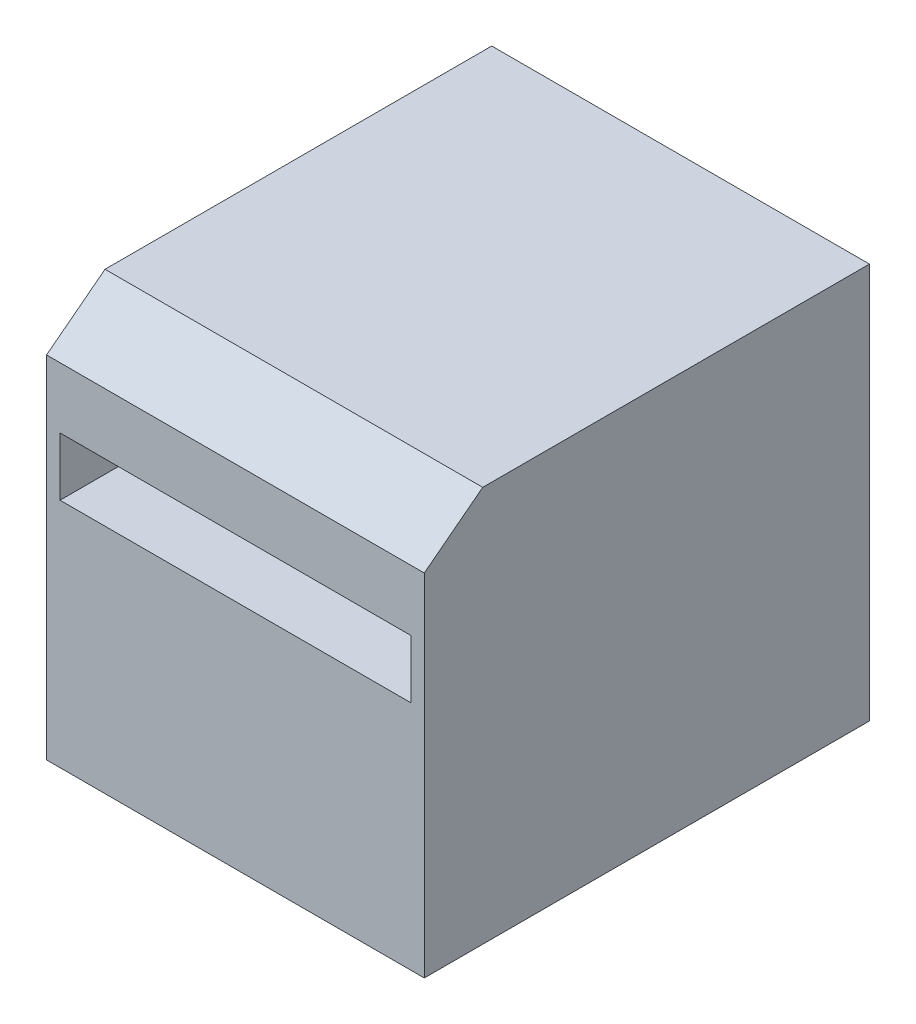
ISO-10303-21;
HEADER;
FILE_DESCRIPTION(('STEP AP214'),'2;1');
FILE_NAME('part.step','',(''),(''),'','','');
FILE_SCHEMA(('AUTOMOTIVE_DESIGN { 1 0 10303 214 1 1 1 1 }'));
ENDSEC;
DATA;
#1=APPLICATION_CONTEXT('core data for automotive mechanical design processes');
#2=APPLICATION_PROTOCOL_DEFINITION('international standard','automotive_design',2000,#1);
#3=PRODUCT_CONTEXT('',#1,'mechanical');
#4=PRODUCT('Part','Part','',(#3));
#5=PRODUCT_RELATED_PRODUCT_CATEGORY('part','',(#4));
#6=PRODUCT_DEFINITION_FORMATION('','',#4);
#7=PRODUCT_DEFINITION_CONTEXT('part definition',#1,'design');
#8=PRODUCT_DEFINITION('design','',#6,#7);
#9=PRODUCT_DEFINITION_SHAPE('','',#8);
#10=(LENGTH_UNIT() NAMED_UNIT(*) SI_UNIT(.MILLI.,.METRE.));
#11=(NAMED_UNIT(*) PLANE_ANGLE_UNIT() SI_UNIT($,.RADIAN.));
#12=(NAMED_UNIT(*) SI_UNIT($,.STERADIAN.) SOLID_ANGLE_UNIT());
#13=UNCERTAINTY_MEASURE_WITH_UNIT(LENGTH_MEASURE(1.E-05),#10,'distance_accuracy_value','');
#14=(GEOMETRIC_REPRESENTATION_CONTEXT(3) GLOBAL_UNCERTAINTY_ASSIGNED_CONTEXT((#13)) GLOBAL_UNIT_ASSIGNED_CONTEXT((#10,
#11,#12)) REPRESENTATION_CONTEXT('',''));
#15=CARTESIAN_POINT('',(0.,0.,0.));
#16=DIRECTION('',(0.,0.,1.));
#17=DIRECTION('',(1.,0.,0.));
#18=AXIS2_PLACEMENT_3D('',#15,#16,#17);
#19=CARTESIAN_POINT('',(84.,0.,0.));
#20=DIRECTION('',(0.,1.,0.));
#21=DIRECTION('',(0.,0.,1.));
#22=AXIS2_PLACEMENT_3D('',#19,#20,#21);
#23=PLANE('',#22);
#24=DIRECTION('',(0.,0.,-1.));
#25=VECTOR('',#24,1.);
#26=CARTESIAN_POINT('',(0.,0.,0.));
#27=LINE('',#26,#25);
#28=CARTESIAN_POINT('',(0.,0.,0.));
#29=VERTEX_POINT('',#28);
#30=CARTESIAN_POINT('',(0.,0.,-99.));
#31=VERTEX_POINT('',#30);
#32=EDGE_CURVE('E153',#29,#31,#27,.T.);
#33=ORIENTED_EDGE('',*,*,#32,.T.);
#34=DIRECTION('',(-1.,0.,0.));
#35=VECTOR('',#34,1.);
#36=CARTESIAN_POINT('',(84.,0.,-99.));
#37=LINE('',#36,#35);
#38=CARTESIAN_POINT('',(84.,0.,-99.));
#39=VERTEX_POINT('',#38);
#40=EDGE_CURVE('E11',#39,#31,#37,.T.);
#41=ORIENTED_EDGE('',*,*,#40,.F.);
#42=DIRECTION('',(0.,0.,-1.));
#43=VECTOR('',#42,1.);
#44=CARTESIAN_POINT('',(84.,0.,0.));
#45=LINE('',#44,#43);
#46=CARTESIAN_POINT('',(84.,0.,0.));
#47=VERTEX_POINT('',#46);
#48=EDGE_CURVE('E159',#47,#39,#45,.T.);
#49=ORIENTED_EDGE('',*,*,#48,.F.);
#50=DIRECTION('',(-1.,0.,0.));
#51=VECTOR('',#50,1.);
#52=CARTESIAN_POINT('',(84.,0.,0.));
#53=LINE('',#52,#51);
#54=EDGE_CURVE('E176',#47,#29,#53,.T.);
#55=ORIENTED_EDGE('',*,*,#54,.T.);
#56=EDGE_LOOP('',(#33,#41,#49,#55));
#57=FACE_BOUND('',#56,.T.);
#58=ADVANCED_FACE('F39',(#57),#23,.F.);
#59=CARTESIAN_POINT('',(84.,0.,-99.));
#60=DIRECTION('',(0.,0.,1.));
#61=DIRECTION('',(1.,0.,0.));
#62=AXIS2_PLACEMENT_3D('',#59,#60,#61);
#63=PLANE('',#62);
#64=DIRECTION('',(-1.,0.,0.));
#65=VECTOR('',#64,1.);
#66=CARTESIAN_POINT('',(3.,51.5188717849238,-99.));
#67=LINE('',#66,#65);
#68=CARTESIAN_POINT('',(81.,51.5188717849237,-99.));
#69=VERTEX_POINT('',#68);
#70=CARTESIAN_POINT('',(3.,51.5188717849238,-99.));
#71=VERTEX_POINT('',#70);
#72=EDGE_CURVE('E144',#69,#71,#67,.T.);
#73=ORIENTED_EDGE('',*,*,#72,.F.);
#74=DIRECTION('',(0.,-1.,0.));
#75=VECTOR('',#74,1.);
#76=CARTESIAN_POINT('',(81.,51.5188717849237,-99.));
#77=LINE('',#76,#75);
#78=CARTESIAN_POINT('',(81.,64.4811282150763,-99.));
#79=VERTEX_POINT('',#78);
#80=EDGE_CURVE('E54',#79,#69,#77,.T.);
#81=ORIENTED_EDGE('',*,*,#80,.F.);
#82=DIRECTION('',(1.,0.,0.));
#83=VECTOR('',#82,1.);
#84=CARTESIAN_POINT('',(3.,64.4811282150763,-99.));
#85=LINE('',#84,#83);
#86=CARTESIAN_POINT('',(3.,64.4811282150763,-99.));
#87=VERTEX_POINT('',#86);
#88=EDGE_CURVE('E131',#87,#79,#85,.T.);
#89=ORIENTED_EDGE('',*,*,#88,.F.);
#90=DIRECTION('',(0.,1.,0.));
#91=VECTOR('',#90,1.);
#92=CARTESIAN_POINT('',(3.,51.5188717849238,-99.));
#93=LINE('',#92,#91);
#94=EDGE_CURVE('E135',#71,#87,#93,.T.);
#95=ORIENTED_EDGE('',*,*,#94,.F.);
#96=EDGE_LOOP('',(#73,#81,#89,#95));
#97=FACE_BOUND('',#96,.T.);
#98=DIRECTION('',(0.,1.,0.));
#99=VECTOR('',#98,1.);
#100=CARTESIAN_POINT('',(0.,0.,-99.));
#101=LINE('',#100,#99);
#102=CARTESIAN_POINT('',(0.,88.,-99.));
#103=VERTEX_POINT('',#102);
#104=EDGE_CURVE('E180',#31,#103,#101,.T.);
#105=ORIENTED_EDGE('',*,*,#104,.T.);
#106=DIRECTION('',(-1.,0.,0.));
#107=VECTOR('',#106,1.);
#108=CARTESIAN_POINT('',(84.,88.,-99.));
#109=LINE('',#108,#107);
#110=CARTESIAN_POINT('',(84.,88.,-99.));
#111=VERTEX_POINT('',#110);
#112=EDGE_CURVE('E47',#111,#103,#109,.T.);
#113=ORIENTED_EDGE('',*,*,#112,.F.);
#114=DIRECTION('',(0.,1.,0.));
#115=VECTOR('',#114,1.);
#116=CARTESIAN_POINT('',(84.,0.,-99.));
#117=LINE('',#116,#115);
#118=EDGE_CURVE('E163',#39,#111,#117,.T.);
#119=ORIENTED_EDGE('',*,*,#118,.F.);
#120=ORIENTED_EDGE('',*,*,#40,.T.);
#121=EDGE_LOOP('',(#105,#113,#119,#120));
#122=FACE_BOUND('',#121,.T.);
#123=ADVANCED_FACE('F225',(#97,#122),#63,.F.);
#124=CARTESIAN_POINT('',(84.,88.,-99.));
#125=DIRECTION('',(0.,-1.,0.));
#126=DIRECTION('',(0.,0.,-1.));
#127=AXIS2_PLACEMENT_3D('',#124,#125,#126);
#128=PLANE('',#127);
#129=DIRECTION('',(0.,0.,1.));
#130=VECTOR('',#129,1.);
#131=CARTESIAN_POINT('',(0.,88.,-99.));
#132=LINE('',#131,#130);
#133=CARTESIAN_POINT('',(0.,88.,-13.));
#134=VERTEX_POINT('',#133);
#135=EDGE_CURVE('E183',#103,#134,#132,.T.);
#136=ORIENTED_EDGE('',*,*,#135,.T.);
#137=DIRECTION('',(-1.,0.,0.));
#138=VECTOR('',#137,1.);
#139=CARTESIAN_POINT('',(84.,88.,-13.));
#140=LINE('',#139,#138);
#141=CARTESIAN_POINT('',(84.,88.,-13.));
#142=VERTEX_POINT('',#141);
#143=EDGE_CURVE('E198',#142,#134,#140,.T.);
#144=ORIENTED_EDGE('',*,*,#143,.F.);
#145=DIRECTION('',(0.,0.,1.));
#146=VECTOR('',#145,1.);
#147=CARTESIAN_POINT('',(84.,88.,-99.));
#148=LINE('',#147,#146);
#149=EDGE_CURVE('E167',#111,#142,#148,.T.);
#150=ORIENTED_EDGE('',*,*,#149,.F.);
#151=ORIENTED_EDGE('',*,*,#112,.T.);
#152=EDGE_LOOP('',(#136,#144,#150,#151));
#153=FACE_BOUND('',#152,.T.);
#154=ADVANCED_FACE('F207',(#153),#128,.F.);
#155=CARTESIAN_POINT('',(84.,78.,0.));
#156=DIRECTION('',(0.,-0.792623989104601,-0.609710760849691));
#157=DIRECTION('',(0.,0.609710760849691,-0.792623989104602));
#158=AXIS2_PLACEMENT_3D('',#155,#156,#157);
#159=PLANE('',#158);
#160=DIRECTION('',(0.,-0.609710760849691,0.792623989104601));
#161=VECTOR('',#160,1.);
#162=CARTESIAN_POINT('',(0.,78.,0.));
#163=LINE('',#162,#161);
#164=CARTESIAN_POINT('',(0.,78.,0.));
#165=VERTEX_POINT('',#164);
#166=EDGE_CURVE('E186',#134,#165,#163,.T.);
#167=ORIENTED_EDGE('',*,*,#166,.T.);
#168=DIRECTION('',(-1.,0.,0.));
#169=VECTOR('',#168,1.);
#170=CARTESIAN_POINT('',(84.,78.,0.));
#171=LINE('',#170,#169);
#172=CARTESIAN_POINT('',(84.,78.,0.));
#173=VERTEX_POINT('',#172);
#174=EDGE_CURVE('E194',#173,#165,#171,.T.);
#175=ORIENTED_EDGE('',*,*,#174,.F.);
#176=DIRECTION('',(0.,-0.609710760849691,0.792623989104601));
#177=VECTOR('',#176,1.);
#178=CARTESIAN_POINT('',(84.,78.,0.));
#179=LINE('',#178,#177);
#180=EDGE_CURVE('E170',#142,#173,#179,.T.);
#181=ORIENTED_EDGE('',*,*,#180,.F.);
#182=ORIENTED_EDGE('',*,*,#143,.T.);
#183=EDGE_LOOP('',(#167,#175,#181,#182));
#184=FACE_BOUND('',#183,.T.);
#185=ADVANCED_FACE('F217',(#184),#159,.F.);
#186=CARTESIAN_POINT('',(84.,0.,0.));
#187=DIRECTION('',(0.,0.,-1.));
#188=DIRECTION('',(-1.,0.,0.));
#189=AXIS2_PLACEMENT_3D('',#186,#187,#188);
#190=PLANE('',#189);
#191=DIRECTION('',(1.,0.,0.));
#192=VECTOR('',#191,1.);
#193=CARTESIAN_POINT('',(3.,64.4811282150763,0.));
#194=LINE('',#193,#192);
#195=CARTESIAN_POINT('',(3.,64.4811282150763,0.));
#196=VERTEX_POINT('',#195);
#197=CARTESIAN_POINT('',(81.,64.4811282150763,0.));
#198=VERTEX_POINT('',#197);
#199=EDGE_CURVE('E119',#196,#198,#194,.T.);
#200=ORIENTED_EDGE('',*,*,#199,.T.);
#201=DIRECTION('',(0.,-1.,0.));
#202=VECTOR('',#201,1.);
#203=CARTESIAN_POINT('',(81.,51.5188717849237,0.));
#204=LINE('',#203,#202);
#205=CARTESIAN_POINT('',(81.,51.5188717849237,0.));
#206=VERTEX_POINT('',#205);
#207=EDGE_CURVE('E112',#198,#206,#204,.T.);
#208=ORIENTED_EDGE('',*,*,#207,.T.);
#209=DIRECTION('',(-1.,0.,0.));
#210=VECTOR('',#209,1.);
#211=CARTESIAN_POINT('',(3.,51.5188717849238,0.));
#212=LINE('',#211,#210);
#213=CARTESIAN_POINT('',(3.,51.5188717849238,0.));
#214=VERTEX_POINT('',#213);
#215=EDGE_CURVE('E122',#206,#214,#212,.T.);
#216=ORIENTED_EDGE('',*,*,#215,.T.);
#217=DIRECTION('',(0.,1.,0.));
#218=VECTOR('',#217,1.);
#219=CARTESIAN_POINT('',(3.,51.5188717849238,0.));
#220=LINE('',#219,#218);
#221=EDGE_CURVE('E62',#214,#196,#220,.T.);
#222=ORIENTED_EDGE('',*,*,#221,.T.);
#223=EDGE_LOOP('',(#200,#208,#216,#222));
#224=FACE_BOUND('',#223,.T.);
#225=DIRECTION('',(0.,-1.,0.));
#226=VECTOR('',#225,1.);
#227=CARTESIAN_POINT('',(0.,0.,0.));
#228=LINE('',#227,#226);
#229=EDGE_CURVE('E164',#165,#29,#228,.T.);
#230=ORIENTED_EDGE('',*,*,#229,.T.);
#231=ORIENTED_EDGE('',*,*,#54,.F.);
#232=DIRECTION('',(0.,-1.,0.));
#233=VECTOR('',#232,1.);
#234=CARTESIAN_POINT('',(84.,0.,0.));
#235=LINE('',#234,#233);
#236=EDGE_CURVE('E173',#173,#47,#235,.T.);
#237=ORIENTED_EDGE('',*,*,#236,.F.);
#238=ORIENTED_EDGE('',*,*,#174,.T.);
#239=EDGE_LOOP('',(#230,#231,#237,#238));
#240=FACE_BOUND('',#239,.T.);
#241=ADVANCED_FACE('F127',(#224,#240),#190,.F.);
#242=CARTESIAN_POINT('',(84.,0.,0.));
#243=DIRECTION('',(1.,0.,0.));
#244=DIRECTION('',(0.,0.,-1.));
#245=AXIS2_PLACEMENT_3D('',#242,#243,#244);
#246=PLANE('',#245);
#247=ORIENTED_EDGE('',*,*,#48,.T.);
#248=ORIENTED_EDGE('',*,*,#118,.T.);
#249=ORIENTED_EDGE('',*,*,#149,.T.);
#250=ORIENTED_EDGE('',*,*,#180,.T.);
#251=ORIENTED_EDGE('',*,*,#236,.T.);
#252=EDGE_LOOP('',(#247,#248,#249,#250,#251));
#253=FACE_BOUND('',#252,.T.);
#254=ADVANCED_FACE('F223',(#253),#246,.T.);
#255=CARTESIAN_POINT('',(0.,0.,0.));
#256=DIRECTION('',(1.,0.,0.));
#257=DIRECTION('',(0.,0.,-1.));
#258=AXIS2_PLACEMENT_3D('',#255,#256,#257);
#259=PLANE('',#258);
#260=ORIENTED_EDGE('',*,*,#32,.F.);
#261=ORIENTED_EDGE('',*,*,#229,.F.);
#262=ORIENTED_EDGE('',*,*,#166,.F.);
#263=ORIENTED_EDGE('',*,*,#135,.F.);
#264=ORIENTED_EDGE('',*,*,#104,.F.);
#265=EDGE_LOOP('',(#260,#261,#262,#263,#264));
#266=FACE_BOUND('',#265,.T.);
#267=ADVANCED_FACE('F213',(#266),#259,.F.);
#268=CARTESIAN_POINT('',(81.,51.5188717849237,0.));
#269=DIRECTION('',(1.,0.,0.));
#270=DIRECTION('',(0.,0.,-1.));
#271=AXIS2_PLACEMENT_3D('',#268,#269,#270);
#272=PLANE('',#271);
#273=ORIENTED_EDGE('',*,*,#80,.T.);
#274=DIRECTION('',(0.,0.,-1.));
#275=VECTOR('',#274,1.);
#276=CARTESIAN_POINT('',(81.,51.5188717849237,0.));
#277=LINE('',#276,#275);
#278=EDGE_CURVE('E108',#206,#69,#277,.T.);
#279=ORIENTED_EDGE('',*,*,#278,.F.);
#280=ORIENTED_EDGE('',*,*,#207,.F.);
#281=DIRECTION('',(0.,0.,-1.));
#282=VECTOR('',#281,1.);
#283=CARTESIAN_POINT('',(81.,64.4811282150763,0.));
#284=LINE('',#283,#282);
#285=EDGE_CURVE('E150',#198,#79,#284,.T.);
#286=ORIENTED_EDGE('',*,*,#285,.T.);
#287=EDGE_LOOP('',(#273,#279,#280,#286));
#288=FACE_BOUND('',#287,.T.);
#289=ADVANCED_FACE('F110',(#288),#272,.F.);
#290=CARTESIAN_POINT('',(3.,64.4811282150763,0.));
#291=DIRECTION('',(0.,1.,0.));
#292=DIRECTION('',(-1.,0.,0.));
#293=AXIS2_PLACEMENT_3D('',#290,#291,#292);
#294=PLANE('',#293);
#295=ORIENTED_EDGE('',*,*,#88,.T.);
#296=ORIENTED_EDGE('',*,*,#285,.F.);
#297=ORIENTED_EDGE('',*,*,#199,.F.);
#298=DIRECTION('',(0.,0.,-1.));
#299=VECTOR('',#298,1.);
#300=CARTESIAN_POINT('',(3.,64.4811282150763,0.));
#301=LINE('',#300,#299);
#302=EDGE_CURVE('E154',#196,#87,#301,.T.);
#303=ORIENTED_EDGE('',*,*,#302,.T.);
#304=EDGE_LOOP('',(#295,#296,#297,#303));
#305=FACE_BOUND('',#304,.T.);
#306=ADVANCED_FACE('F247',(#305),#294,.F.);
#307=CARTESIAN_POINT('',(3.,51.5188717849238,0.));
#308=DIRECTION('',(-1.,0.,0.));
#309=DIRECTION('',(0.,-1.,0.));
#310=AXIS2_PLACEMENT_3D('',#307,#308,#309);
#311=PLANE('',#310);
#312=ORIENTED_EDGE('',*,*,#94,.T.);
#313=ORIENTED_EDGE('',*,*,#302,.F.);
#314=ORIENTED_EDGE('',*,*,#221,.F.);
#315=DIRECTION('',(0.,0.,-1.));
#316=VECTOR('',#315,1.);
#317=CARTESIAN_POINT('',(3.,51.5188717849238,0.));
#318=LINE('',#317,#316);
#319=EDGE_CURVE('E118',#214,#71,#318,.T.);
#320=ORIENTED_EDGE('',*,*,#319,.T.);
#321=EDGE_LOOP('',(#312,#313,#314,#320));
#322=FACE_BOUND('',#321,.T.);
#323=ADVANCED_FACE('F250',(#322),#311,.F.);
#324=CARTESIAN_POINT('',(3.,51.5188717849238,0.));
#325=DIRECTION('',(0.,-1.,0.));
#326=DIRECTION('',(1.,0.,0.));
#327=AXIS2_PLACEMENT_3D('',#324,#325,#326);
#328=PLANE('',#327);
#329=ORIENTED_EDGE('',*,*,#72,.T.);
#330=ORIENTED_EDGE('',*,*,#319,.F.);
#331=ORIENTED_EDGE('',*,*,#215,.F.);
#332=ORIENTED_EDGE('',*,*,#278,.T.);
#333=EDGE_LOOP('',(#329,#330,#331,#332));
#334=FACE_BOUND('',#333,.T.);
#335=ADVANCED_FACE('F123',(#334),#328,.F.);
#336=CLOSED_SHELL('',(#58,#123,#154,#185,#241,#254,#267,#289,#306,#323,#335));
#337=MANIFOLD_SOLID_BREP('B2',#336);
#338=ADVANCED_BREP_SHAPE_REPRESENTATION('',(#18,#337),#14);
#339=SHAPE_DEFINITION_REPRESENTATION(#9,#338);
ENDSEC;
END-ISO-10303-21;
